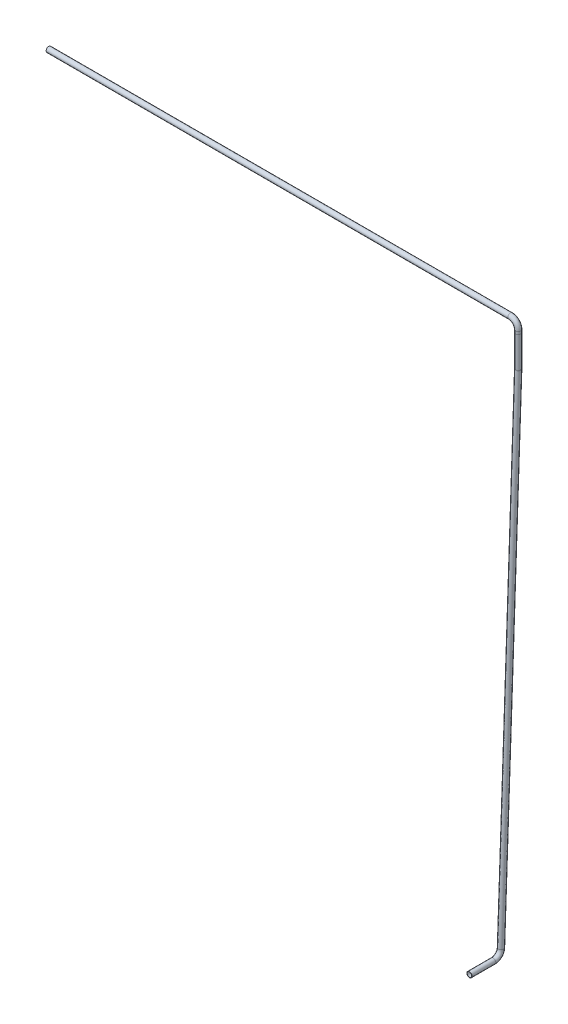
ISO-10303-21;
HEADER;
FILE_DESCRIPTION(('STEP AP214'),'2;1');
FILE_NAME('part.step','',(''),(''),'','','');
FILE_SCHEMA(('AUTOMOTIVE_DESIGN { 1 0 10303 214 1 1 1 1 }'));
ENDSEC;
DATA;
#1=APPLICATION_CONTEXT('core data for automotive mechanical design processes');
#2=APPLICATION_PROTOCOL_DEFINITION('international standard','automotive_design',2000,#1);
#3=PRODUCT_CONTEXT('',#1,'mechanical');
#4=PRODUCT('Part','Part','',(#3));
#5=PRODUCT_RELATED_PRODUCT_CATEGORY('part','',(#4));
#6=PRODUCT_DEFINITION_FORMATION('','',#4);
#7=PRODUCT_DEFINITION_CONTEXT('part definition',#1,'design');
#8=PRODUCT_DEFINITION('design','',#6,#7);
#9=PRODUCT_DEFINITION_SHAPE('','',#8);
#10=(LENGTH_UNIT() NAMED_UNIT(*) SI_UNIT(.MILLI.,.METRE.));
#11=(NAMED_UNIT(*) PLANE_ANGLE_UNIT() SI_UNIT($,.RADIAN.));
#12=(NAMED_UNIT(*) SI_UNIT($,.STERADIAN.) SOLID_ANGLE_UNIT());
#13=UNCERTAINTY_MEASURE_WITH_UNIT(LENGTH_MEASURE(1.E-05),#10,'distance_accuracy_value','');
#14=(GEOMETRIC_REPRESENTATION_CONTEXT(3) GLOBAL_UNCERTAINTY_ASSIGNED_CONTEXT((#13)) GLOBAL_UNIT_ASSIGNED_CONTEXT((#10,
#11,#12)) REPRESENTATION_CONTEXT('',''));
#15=CARTESIAN_POINT('',(0.,0.,0.));
#16=DIRECTION('',(0.,0.,1.));
#17=DIRECTION('',(1.,0.,0.));
#18=AXIS2_PLACEMENT_3D('',#15,#16,#17);
#19=CARTESIAN_POINT('',(0.,0.,0.));
#20=DIRECTION('',(0.,0.,-1.));
#21=DIRECTION('',(-1.,0.,0.));
#22=AXIS2_PLACEMENT_3D('',#19,#20,#21);
#23=CYLINDRICAL_SURFACE('',#22,12.7);
#24=CARTESIAN_POINT('',(0.,0.,-115.60725767985));
#25=DIRECTION('',(0.,0.,1.));
#26=DIRECTION('',(1.,0.,0.));
#27=AXIS2_PLACEMENT_3D('',#24,#25,#26);
#28=CIRCLE('',#27,12.7);
#29=CARTESIAN_POINT('',(0.,-12.7,-115.60725767985));
#30=VERTEX_POINT('',#29);
#31=EDGE_CURVE('E152',#30,#30,#28,.T.);
#32=ORIENTED_EDGE('',*,*,#31,.T.);
#33=EDGE_LOOP('',(#32));
#34=FACE_BOUND('',#33,.T.);
#35=CARTESIAN_POINT('',(0.,0.,0.));
#36=DIRECTION('',(0.,0.,1.));
#37=DIRECTION('',(1.,0.,0.));
#38=AXIS2_PLACEMENT_3D('',#35,#36,#37);
#39=CIRCLE('',#38,12.7);
#40=CARTESIAN_POINT('',(12.7,0.,0.));
#41=VERTEX_POINT('',#40);
#42=EDGE_CURVE('E55',#41,#41,#39,.T.);
#43=ORIENTED_EDGE('',*,*,#42,.F.);
#44=EDGE_LOOP('',(#43));
#45=FACE_BOUND('',#44,.T.);
#46=ADVANCED_FACE('F39',(#34,#45),#23,.T.);
#47=CARTESIAN_POINT('',(0.,38.1,-115.60725767985));
#48=DIRECTION('',(1.,0.,0.));
#49=DIRECTION('',(0.,0.,-1.));
#50=AXIS2_PLACEMENT_3D('',#47,#48,#49);
#51=TOROIDAL_SURFACE('',#50,38.1,12.7);
#52=CARTESIAN_POINT('',(0.,36.7703291756349,-153.684048189278));
#53=DIRECTION('',(0.,-0.999390827019096,0.0348994967024963));
#54=DIRECTION('',(1.,0.,0.));
#55=AXIS2_PLACEMENT_3D('',#52,#53,#54);
#56=CIRCLE('',#55,12.7);
#57=CARTESIAN_POINT('',(0.,36.3271055675132,-166.37631169242));
#58=VERTEX_POINT('',#57);
#59=EDGE_CURVE('E156',#58,#58,#56,.T.);
#60=CARTESIAN_POINT('',(0.,38.1,-115.60725767985));
#61=DIRECTION('',(1.,0.,0.));
#62=DIRECTION('',(0.,0.,-1.));
#63=AXIS2_PLACEMENT_3D('',#60,#61,#62);
#64=CIRCLE('',#63,50.8);
#65=EDGE_CURVE('',#30,#58,#64,.T.);
#66=ORIENTED_EDGE('',*,*,#31,.F.);
#67=ORIENTED_EDGE('',*,*,#59,.T.);
#68=ORIENTED_EDGE('',*,*,#65,.T.);
#69=ORIENTED_EDGE('',*,*,#65,.F.);
#70=EDGE_LOOP('',(#66,#68,#67,#69));
#71=FACE_BOUND('',#70,.T.);
#72=ADVANCED_FACE('F205',(#71),#51,.T.);
#73=CARTESIAN_POINT('',(0.,36.7703291756349,-153.684048189278));
#74=DIRECTION('',(0.,0.999390827019096,-0.0348994967024968));
#75=DIRECTION('',(0.,0.0348994967024968,0.999390827019096));
#76=AXIS2_PLACEMENT_3D('',#73,#74,#75);
#77=CYLINDRICAL_SURFACE('',#76,12.7);
#78=CARTESIAN_POINT('',(0.,2436.02841546923,-237.467986771938));
#79=DIRECTION('',(0.,-0.999390827019096,0.0348994967024968));
#80=DIRECTION('',(1.,0.,0.));
#81=AXIS2_PLACEMENT_3D('',#78,#79,#80);
#82=CIRCLE('',#81,12.7);
#83=CARTESIAN_POINT('',(0.,2435.58519186111,-250.160250275081));
#84=VERTEX_POINT('',#83);
#85=EDGE_CURVE('E160',#84,#84,#82,.T.);
#86=ORIENTED_EDGE('',*,*,#85,.T.);
#87=EDGE_LOOP('',(#86));
#88=FACE_BOUND('',#87,.T.);
#89=ORIENTED_EDGE('',*,*,#59,.F.);
#90=EDGE_LOOP('',(#89));
#91=FACE_BOUND('',#90,.T.);
#92=ADVANCED_FACE('F201',(#88,#91),#77,.T.);
#93=CARTESIAN_POINT('',(0.,2437.80130990172,-186.698932759368));
#94=DIRECTION('',(1.,0.,0.));
#95=DIRECTION('',(0.,0.,-1.));
#96=AXIS2_PLACEMENT_3D('',#93,#94,#95);
#97=TOROIDAL_SURFACE('',#96,50.8,12.7);
#98=CARTESIAN_POINT('',(0.,2437.80130990172,-237.498932759368));
#99=DIRECTION('',(0.,-1.,0.));
#100=DIRECTION('',(1.,0.,0.));
#101=AXIS2_PLACEMENT_3D('',#98,#99,#100);
#102=CIRCLE('',#101,12.7);
#103=CARTESIAN_POINT('',(0.,2437.80130990172,-250.198932759368));
#104=VERTEX_POINT('',#103);
#105=EDGE_CURVE('E164',#104,#104,#102,.T.);
#106=CARTESIAN_POINT('',(0.,2437.80130990172,-186.698932759368));
#107=DIRECTION('',(1.,0.,0.));
#108=DIRECTION('',(0.,0.,-1.));
#109=AXIS2_PLACEMENT_3D('',#106,#107,#108);
#110=CIRCLE('',#109,63.5);
#111=EDGE_CURVE('',#84,#104,#110,.T.);
#112=ORIENTED_EDGE('',*,*,#85,.F.);
#113=ORIENTED_EDGE('',*,*,#105,.T.);
#114=ORIENTED_EDGE('',*,*,#111,.T.);
#115=ORIENTED_EDGE('',*,*,#111,.F.);
#116=EDGE_LOOP('',(#112,#114,#113,#115));
#117=FACE_BOUND('',#116,.T.);
#118=ADVANCED_FACE('F197',(#117),#97,.T.);
#119=CARTESIAN_POINT('',(0.,2437.80130990172,-237.498932759368));
#120=DIRECTION('',(0.,1.,0.));
#121=DIRECTION('',(0.,0.,1.));
#122=AXIS2_PLACEMENT_3D('',#119,#120,#121);
#123=CYLINDRICAL_SURFACE('',#122,12.7);
#124=CARTESIAN_POINT('',(0.,2589.31459260336,-237.498932759368));
#125=DIRECTION('',(0.,-1.,0.));
#126=DIRECTION('',(1.,0.,0.));
#127=AXIS2_PLACEMENT_3D('',#124,#125,#126);
#128=CIRCLE('',#127,12.7);
#129=CARTESIAN_POINT('',(12.7,2589.31459260336,-237.498932759368));
#130=VERTEX_POINT('',#129);
#131=EDGE_CURVE('E168',#130,#130,#128,.T.);
#132=ORIENTED_EDGE('',*,*,#131,.T.);
#133=EDGE_LOOP('',(#132));
#134=FACE_BOUND('',#133,.T.);
#135=ORIENTED_EDGE('',*,*,#105,.F.);
#136=EDGE_LOOP('',(#135));
#137=FACE_BOUND('',#136,.T.);
#138=ADVANCED_FACE('F192',(#134,#137),#123,.T.);
#139=CARTESIAN_POINT('',(0.,2589.31459260336,-237.498932759368));
#140=DIRECTION('',(0.,1.,0.));
#141=DIRECTION('',(0.,0.,1.));
#142=AXIS2_PLACEMENT_3D('',#139,#140,#141);
#143=CYLINDRICAL_SURFACE('',#142,12.7);
#144=CARTESIAN_POINT('',(0.,2602.01459260336,-237.498932759368));
#145=DIRECTION('',(0.,-1.,0.));
#146=DIRECTION('',(1.,0.,0.));
#147=AXIS2_PLACEMENT_3D('',#144,#145,#146);
#148=CIRCLE('',#147,12.7);
#149=CARTESIAN_POINT('',(12.7,2602.01459260336,-237.498932759368));
#150=VERTEX_POINT('',#149);
#151=EDGE_CURVE('E171',#150,#150,#148,.T.);
#152=ORIENTED_EDGE('',*,*,#151,.T.);
#153=EDGE_LOOP('',(#152));
#154=FACE_BOUND('',#153,.T.);
#155=ORIENTED_EDGE('',*,*,#131,.F.);
#156=EDGE_LOOP('',(#155));
#157=FACE_BOUND('',#156,.T.);
#158=ADVANCED_FACE('F188',(#154,#157),#143,.T.);
#159=CARTESIAN_POINT('',(-38.1,2602.01459260336,-237.498932759368));
#160=DIRECTION('',(0.,0.,1.));
#161=DIRECTION('',(0.,-1.,0.));
#162=AXIS2_PLACEMENT_3D('',#159,#160,#161);
#163=TOROIDAL_SURFACE('',#162,38.1,12.7);
#164=CARTESIAN_POINT('',(-38.1,2640.11459260336,-237.498932759368));
#165=DIRECTION('',(1.,0.,0.));
#166=DIRECTION('',(0.,1.,0.));
#167=AXIS2_PLACEMENT_3D('',#164,#165,#166);
#168=CIRCLE('',#167,12.7);
#169=CARTESIAN_POINT('',(-38.1,2652.81459260336,-237.498932759368));
#170=VERTEX_POINT('',#169);
#171=EDGE_CURVE('E43',#170,#170,#168,.T.);
#172=CARTESIAN_POINT('',(-38.1,2602.01459260336,-237.498932759368));
#173=DIRECTION('',(0.,0.,1.));
#174=DIRECTION('',(0.,-1.,0.));
#175=AXIS2_PLACEMENT_3D('',#172,#173,#174);
#176=CIRCLE('',#175,50.8);
#177=EDGE_CURVE('',#150,#170,#176,.T.);
#178=ORIENTED_EDGE('',*,*,#151,.F.);
#179=ORIENTED_EDGE('',*,*,#171,.T.);
#180=ORIENTED_EDGE('',*,*,#177,.T.);
#181=ORIENTED_EDGE('',*,*,#177,.F.);
#182=EDGE_LOOP('',(#178,#180,#179,#181));
#183=FACE_BOUND('',#182,.T.);
#184=ADVANCED_FACE('F180',(#183),#163,.T.);
#185=CARTESIAN_POINT('',(-38.1,2640.11459260336,-237.498932759368));
#186=DIRECTION('',(-1.,0.,0.));
#187=DIRECTION('',(0.,-1.,0.));
#188=AXIS2_PLACEMENT_3D('',#185,#186,#187);
#189=CYLINDRICAL_SURFACE('',#188,12.7);
#190=CARTESIAN_POINT('',(-2286.,2640.11459260336,-237.498932759368));
#191=DIRECTION('',(1.,0.,0.));
#192=DIRECTION('',(0.,1.,0.));
#193=AXIS2_PLACEMENT_3D('',#190,#191,#192);
#194=CIRCLE('',#193,12.7);
#195=CARTESIAN_POINT('',(-2286.,2652.81459260336,-237.498932759368));
#196=VERTEX_POINT('',#195);
#197=EDGE_CURVE('E60',#196,#196,#194,.T.);
#198=ORIENTED_EDGE('',*,*,#197,.T.);
#199=EDGE_LOOP('',(#198));
#200=FACE_BOUND('',#199,.T.);
#201=ORIENTED_EDGE('',*,*,#171,.F.);
#202=EDGE_LOOP('',(#201));
#203=FACE_BOUND('',#202,.T.);
#204=ADVANCED_FACE('F41',(#200,#203),#189,.T.);
#205=CARTESIAN_POINT('',(0.,0.,0.));
#206=DIRECTION('',(0.,0.,1.));
#207=DIRECTION('',(1.,0.,0.));
#208=AXIS2_PLACEMENT_3D('',#205,#206,#207);
#209=PLANE('',#208);
#210=CARTESIAN_POINT('',(0.,0.,0.));
#211=DIRECTION('',(0.,0.,1.));
#212=DIRECTION('',(1.,0.,0.));
#213=AXIS2_PLACEMENT_3D('',#210,#211,#212);
#214=CIRCLE('',#213,11.1125);
#215=CARTESIAN_POINT('',(11.1125,0.,0.));
#216=VERTEX_POINT('',#215);
#217=EDGE_CURVE('E121',#216,#216,#214,.F.);
#218=ORIENTED_EDGE('',*,*,#217,.T.);
#219=EDGE_LOOP('',(#218));
#220=FACE_BOUND('',#219,.T.);
#221=ORIENTED_EDGE('',*,*,#42,.T.);
#222=EDGE_LOOP('',(#221));
#223=FACE_BOUND('',#222,.T.);
#224=ADVANCED_FACE('F73',(#220,#223),#209,.T.);
#225=CARTESIAN_POINT('',(-2286.,2640.11459260336,-237.498932759368));
#226=DIRECTION('',(1.,0.,0.));
#227=DIRECTION('',(0.,1.,0.));
#228=AXIS2_PLACEMENT_3D('',#225,#226,#227);
#229=PLANE('',#228);
#230=CARTESIAN_POINT('',(-2286.,2640.11459260336,-237.498932759368));
#231=DIRECTION('',(1.,0.,0.));
#232=DIRECTION('',(0.,1.,0.));
#233=AXIS2_PLACEMENT_3D('',#230,#231,#232);
#234=CIRCLE('',#233,11.1125);
#235=CARTESIAN_POINT('',(-2286.,2651.22709260336,-237.498932759368));
#236=VERTEX_POINT('',#235);
#237=EDGE_CURVE('E11',#236,#236,#234,.F.);
#238=ORIENTED_EDGE('',*,*,#237,.F.);
#239=EDGE_LOOP('',(#238));
#240=FACE_BOUND('',#239,.T.);
#241=ORIENTED_EDGE('',*,*,#197,.F.);
#242=EDGE_LOOP('',(#241));
#243=FACE_BOUND('',#242,.T.);
#244=ADVANCED_FACE('F70',(#240,#243),#229,.F.);
#245=CARTESIAN_POINT('',(0.,0.,0.));
#246=DIRECTION('',(0.,0.,-1.));
#247=DIRECTION('',(-1.,0.,0.));
#248=AXIS2_PLACEMENT_3D('',#245,#246,#247);
#249=CYLINDRICAL_SURFACE('',#248,11.1125);
#250=CARTESIAN_POINT('',(0.,0.,-115.60725767985));
#251=DIRECTION('',(0.,0.,1.));
#252=DIRECTION('',(1.,0.,0.));
#253=AXIS2_PLACEMENT_3D('',#250,#251,#252);
#254=CIRCLE('',#253,11.1125);
#255=CARTESIAN_POINT('',(0.,-11.1125,-115.60725767985));
#256=VERTEX_POINT('',#255);
#257=EDGE_CURVE('E119',#256,#256,#254,.F.);
#258=ORIENTED_EDGE('',*,*,#257,.T.);
#259=EDGE_LOOP('',(#258));
#260=FACE_BOUND('',#259,.T.);
#261=ORIENTED_EDGE('',*,*,#217,.F.);
#262=EDGE_LOOP('',(#261));
#263=FACE_BOUND('',#262,.T.);
#264=ADVANCED_FACE('F72',(#260,#263),#249,.F.);
#265=CARTESIAN_POINT('',(0.,38.1,-115.60725767985));
#266=DIRECTION('',(1.,0.,0.));
#267=DIRECTION('',(0.,0.,-1.));
#268=AXIS2_PLACEMENT_3D('',#265,#266,#267);
#269=TOROIDAL_SURFACE('',#268,38.1,11.1125);
#270=CARTESIAN_POINT('',(0.,36.7703291756349,-153.684048189278));
#271=DIRECTION('',(0.,-0.999390827019096,0.0348994967024963));
#272=DIRECTION('',(1.,0.,0.));
#273=AXIS2_PLACEMENT_3D('',#270,#271,#272);
#274=CIRCLE('',#273,11.1125);
#275=CARTESIAN_POINT('',(0.,36.3825085185284,-164.789778754528));
#276=VERTEX_POINT('',#275);
#277=EDGE_CURVE('E116',#276,#276,#274,.F.);
#278=CARTESIAN_POINT('',(0.,38.1,-115.60725767985));
#279=DIRECTION('',(1.,0.,0.));
#280=DIRECTION('',(0.,0.,-1.));
#281=AXIS2_PLACEMENT_3D('',#278,#279,#280);
#282=CIRCLE('',#281,49.2125);
#283=EDGE_CURVE('',#256,#276,#282,.T.);
#284=ORIENTED_EDGE('',*,*,#257,.F.);
#285=ORIENTED_EDGE('',*,*,#277,.T.);
#286=ORIENTED_EDGE('',*,*,#283,.T.);
#287=ORIENTED_EDGE('',*,*,#283,.F.);
#288=EDGE_LOOP('',(#284,#286,#285,#287));
#289=FACE_BOUND('',#288,.T.);
#290=ADVANCED_FACE('F79',(#289),#269,.F.);
#291=CARTESIAN_POINT('',(0.,36.7703291756349,-153.684048189278));
#292=DIRECTION('',(0.,0.999390827019096,-0.0348994967024968));
#293=DIRECTION('',(0.,0.0348994967024968,0.999390827019096));
#294=AXIS2_PLACEMENT_3D('',#291,#292,#293);
#295=CYLINDRICAL_SURFACE('',#294,11.1125);
#296=CARTESIAN_POINT('',(0.,2436.02841546923,-237.467986771938));
#297=DIRECTION('',(0.,-0.999390827019096,0.0348994967024968));
#298=DIRECTION('',(1.,0.,0.));
#299=AXIS2_PLACEMENT_3D('',#296,#297,#298);
#300=CIRCLE('',#299,11.1125);
#301=CARTESIAN_POINT('',(0.,2435.64059481212,-248.573717337188));
#302=VERTEX_POINT('',#301);
#303=EDGE_CURVE('E125',#302,#302,#300,.F.);
#304=ORIENTED_EDGE('',*,*,#303,.T.);
#305=EDGE_LOOP('',(#304));
#306=FACE_BOUND('',#305,.T.);
#307=ORIENTED_EDGE('',*,*,#277,.F.);
#308=EDGE_LOOP('',(#307));
#309=FACE_BOUND('',#308,.T.);
#310=ADVANCED_FACE('F104',(#306,#309),#295,.F.);
#311=CARTESIAN_POINT('',(0.,2437.80130990172,-186.698932759368));
#312=DIRECTION('',(1.,0.,0.));
#313=DIRECTION('',(0.,0.,-1.));
#314=AXIS2_PLACEMENT_3D('',#311,#312,#313);
#315=TOROIDAL_SURFACE('',#314,50.8,11.1125);
#316=CARTESIAN_POINT('',(0.,2437.80130990172,-237.498932759368));
#317=DIRECTION('',(0.,-1.,0.));
#318=DIRECTION('',(1.,0.,0.));
#319=AXIS2_PLACEMENT_3D('',#316,#317,#318);
#320=CIRCLE('',#319,11.1125);
#321=CARTESIAN_POINT('',(0.,2437.80130990172,-248.611432759368));
#322=VERTEX_POINT('',#321);
#323=EDGE_CURVE('E133',#322,#322,#320,.F.);
#324=CARTESIAN_POINT('',(0.,2437.80130990172,-186.698932759368));
#325=DIRECTION('',(1.,0.,0.));
#326=DIRECTION('',(0.,0.,-1.));
#327=AXIS2_PLACEMENT_3D('',#324,#325,#326);
#328=CIRCLE('',#327,61.9125);
#329=EDGE_CURVE('',#302,#322,#328,.T.);
#330=ORIENTED_EDGE('',*,*,#303,.F.);
#331=ORIENTED_EDGE('',*,*,#323,.T.);
#332=ORIENTED_EDGE('',*,*,#329,.T.);
#333=ORIENTED_EDGE('',*,*,#329,.F.);
#334=EDGE_LOOP('',(#330,#332,#331,#333));
#335=FACE_BOUND('',#334,.T.);
#336=ADVANCED_FACE('F100',(#335),#315,.F.);
#337=CARTESIAN_POINT('',(0.,2437.80130990172,-237.498932759368));
#338=DIRECTION('',(0.,1.,0.));
#339=DIRECTION('',(0.,0.,1.));
#340=AXIS2_PLACEMENT_3D('',#337,#338,#339);
#341=CYLINDRICAL_SURFACE('',#340,11.1125);
#342=CARTESIAN_POINT('',(0.,2589.31459260336,-237.498932759368));
#343=DIRECTION('',(0.,-1.,0.));
#344=DIRECTION('',(1.,0.,0.));
#345=AXIS2_PLACEMENT_3D('',#342,#343,#344);
#346=CIRCLE('',#345,11.1125);
#347=CARTESIAN_POINT('',(11.1125,2589.31459260336,-237.498932759368));
#348=VERTEX_POINT('',#347);
#349=EDGE_CURVE('E137',#348,#348,#346,.F.);
#350=ORIENTED_EDGE('',*,*,#349,.T.);
#351=EDGE_LOOP('',(#350));
#352=FACE_BOUND('',#351,.T.);
#353=ORIENTED_EDGE('',*,*,#323,.F.);
#354=EDGE_LOOP('',(#353));
#355=FACE_BOUND('',#354,.T.);
#356=ADVANCED_FACE('F96',(#352,#355),#341,.F.);
#357=CARTESIAN_POINT('',(0.,2589.31459260336,-237.498932759368));
#358=DIRECTION('',(0.,1.,0.));
#359=DIRECTION('',(0.,0.,1.));
#360=AXIS2_PLACEMENT_3D('',#357,#358,#359);
#361=CYLINDRICAL_SURFACE('',#360,11.1125);
#362=CARTESIAN_POINT('',(0.,2602.01459260336,-237.498932759368));
#363=DIRECTION('',(0.,-1.,0.));
#364=DIRECTION('',(1.,0.,0.));
#365=AXIS2_PLACEMENT_3D('',#362,#363,#364);
#366=CIRCLE('',#365,11.1125);
#367=CARTESIAN_POINT('',(11.1125,2602.01459260336,-237.498932759368));
#368=VERTEX_POINT('',#367);
#369=EDGE_CURVE('E141',#368,#368,#366,.F.);
#370=ORIENTED_EDGE('',*,*,#369,.T.);
#371=EDGE_LOOP('',(#370));
#372=FACE_BOUND('',#371,.T.);
#373=ORIENTED_EDGE('',*,*,#349,.F.);
#374=EDGE_LOOP('',(#373));
#375=FACE_BOUND('',#374,.T.);
#376=ADVANCED_FACE('F90',(#372,#375),#361,.F.);
#377=CARTESIAN_POINT('',(-38.1,2602.01459260336,-237.498932759368));
#378=DIRECTION('',(0.,0.,1.));
#379=DIRECTION('',(0.,-1.,0.));
#380=AXIS2_PLACEMENT_3D('',#377,#378,#379);
#381=TOROIDAL_SURFACE('',#380,38.1,11.1125);
#382=CARTESIAN_POINT('',(-38.1,2640.11459260336,-237.498932759368));
#383=DIRECTION('',(1.,0.,0.));
#384=DIRECTION('',(0.,1.,0.));
#385=AXIS2_PLACEMENT_3D('',#382,#383,#384);
#386=CIRCLE('',#385,11.1125);
#387=CARTESIAN_POINT('',(-38.1,2651.22709260336,-237.498932759368));
#388=VERTEX_POINT('',#387);
#389=EDGE_CURVE('E49',#388,#388,#386,.F.);
#390=CARTESIAN_POINT('',(-38.1,2602.01459260336,-237.498932759368));
#391=DIRECTION('',(0.,0.,1.));
#392=DIRECTION('',(0.,-1.,0.));
#393=AXIS2_PLACEMENT_3D('',#390,#391,#392);
#394=CIRCLE('',#393,49.2125);
#395=EDGE_CURVE('',#368,#388,#394,.T.);
#396=ORIENTED_EDGE('',*,*,#369,.F.);
#397=ORIENTED_EDGE('',*,*,#389,.T.);
#398=ORIENTED_EDGE('',*,*,#395,.T.);
#399=ORIENTED_EDGE('',*,*,#395,.F.);
#400=EDGE_LOOP('',(#396,#398,#397,#399));
#401=FACE_BOUND('',#400,.T.);
#402=ADVANCED_FACE('F86',(#401),#381,.F.);
#403=CARTESIAN_POINT('',(-38.1,2640.11459260336,-237.498932759368));
#404=DIRECTION('',(-1.,0.,0.));
#405=DIRECTION('',(0.,-1.,0.));
#406=AXIS2_PLACEMENT_3D('',#403,#404,#405);
#407=CYLINDRICAL_SURFACE('',#406,11.1125);
#408=ORIENTED_EDGE('',*,*,#237,.T.);
#409=EDGE_LOOP('',(#408));
#410=FACE_BOUND('',#409,.T.);
#411=ORIENTED_EDGE('',*,*,#389,.F.);
#412=EDGE_LOOP('',(#411));
#413=FACE_BOUND('',#412,.T.);
#414=ADVANCED_FACE('F67',(#410,#413),#407,.F.);
#415=CLOSED_SHELL('',(#46,#72,#92,#118,#138,#158,#184,#204,#224,#244,#264,#290,#310,#336,#356,
#376,#402,#414));
#416=MANIFOLD_SOLID_BREP('B2',#415);
#417=ADVANCED_BREP_SHAPE_REPRESENTATION('',(#18,#416),#14);
#418=SHAPE_DEFINITION_REPRESENTATION(#9,#417);
ENDSEC;
END-ISO-10303-21;
